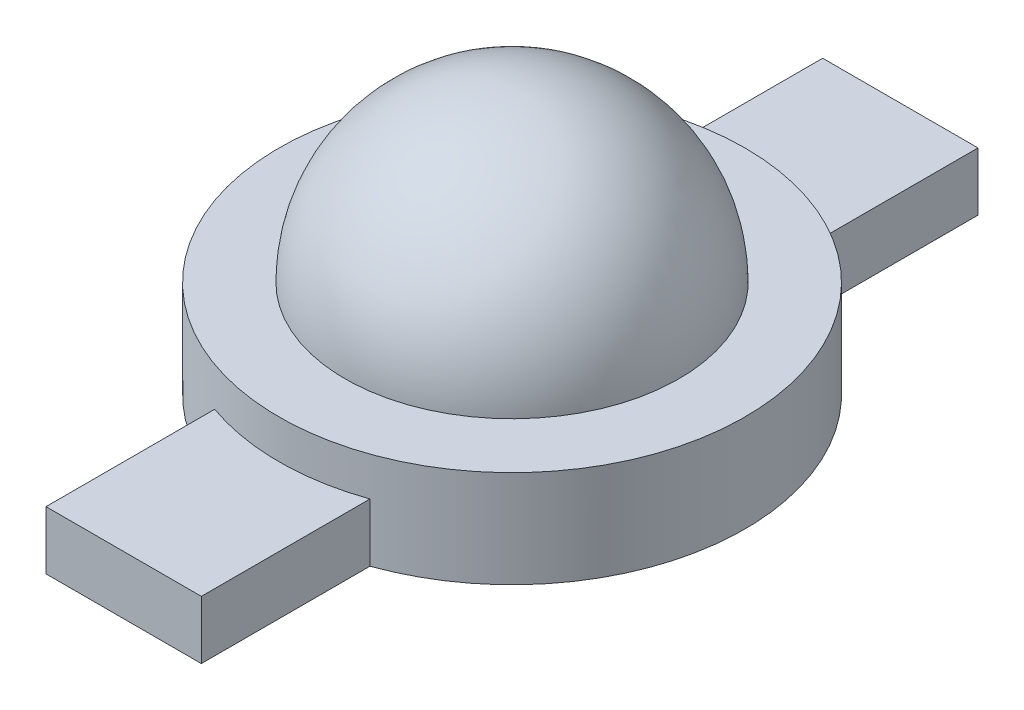
ISO-10303-21;
HEADER;
FILE_DESCRIPTION(('STEP AP214'),'2;1');
FILE_NAME('part.step','',(''),(''),'','','');
FILE_SCHEMA(('AUTOMOTIVE_DESIGN { 1 0 10303 214 1 1 1 1 }'));
ENDSEC;
DATA;
#1=APPLICATION_CONTEXT('core data for automotive mechanical design processes');
#2=APPLICATION_PROTOCOL_DEFINITION('international standard','automotive_design',2000,#1);
#3=PRODUCT_CONTEXT('',#1,'mechanical');
#4=PRODUCT('Part','Part','',(#3));
#5=PRODUCT_RELATED_PRODUCT_CATEGORY('part','',(#4));
#6=PRODUCT_DEFINITION_FORMATION('','',#4);
#7=PRODUCT_DEFINITION_CONTEXT('part definition',#1,'design');
#8=PRODUCT_DEFINITION('design','',#6,#7);
#9=PRODUCT_DEFINITION_SHAPE('','',#8);
#10=(LENGTH_UNIT() NAMED_UNIT(*) SI_UNIT(.MILLI.,.METRE.));
#11=(NAMED_UNIT(*) PLANE_ANGLE_UNIT() SI_UNIT($,.RADIAN.));
#12=(NAMED_UNIT(*) SI_UNIT($,.STERADIAN.) SOLID_ANGLE_UNIT());
#13=UNCERTAINTY_MEASURE_WITH_UNIT(LENGTH_MEASURE(1.E-05),#10,'distance_accuracy_value','');
#14=(GEOMETRIC_REPRESENTATION_CONTEXT(3) GLOBAL_UNCERTAINTY_ASSIGNED_CONTEXT((#13)) GLOBAL_UNIT_ASSIGNED_CONTEXT((#10,
#11,#12)) REPRESENTATION_CONTEXT('',''));
#15=CARTESIAN_POINT('',(0.,0.,0.));
#16=DIRECTION('',(0.,0.,1.));
#17=DIRECTION('',(1.,0.,0.));
#18=AXIS2_PLACEMENT_3D('',#15,#16,#17);
#19=CARTESIAN_POINT('',(0.,0.,0.));
#20=DIRECTION('',(0.,-1.,0.));
#21=DIRECTION('',(0.,0.,-1.));
#22=AXIS2_PLACEMENT_3D('',#19,#20,#21);
#23=SPHERICAL_SURFACE('',#22,4.3);
#24=CARTESIAN_POINT('',(0.,0.,0.));
#25=DIRECTION('',(0.,-1.,0.));
#26=DIRECTION('',(0.,0.,-1.));
#27=AXIS2_PLACEMENT_3D('',#24,#25,#26);
#28=CIRCLE('',#27,4.3);
#29=CARTESIAN_POINT('',(0.,0.,-4.3));
#30=VERTEX_POINT('',#29);
#31=EDGE_CURVE('E154',#30,#30,#28,.T.);
#32=ORIENTED_EDGE('',*,*,#31,.F.);
#33=EDGE_LOOP('',(#32));
#34=FACE_BOUND('',#33,.T.);
#35=ADVANCED_FACE('F32',(#34),#23,.T.);
#36=CARTESIAN_POINT('',(0.,-2.5,-6.));
#37=DIRECTION('',(0.,-1.,0.));
#38=DIRECTION('',(0.,0.,-1.));
#39=AXIS2_PLACEMENT_3D('',#36,#37,#38);
#40=PLANE('',#39);
#41=CARTESIAN_POINT('',(0.,-2.5,0.));
#42=DIRECTION('',(0.,-1.,0.));
#43=DIRECTION('',(0.,0.,-1.));
#44=AXIS2_PLACEMENT_3D('',#41,#42,#43);
#45=CIRCLE('',#44,6.);
#46=CARTESIAN_POINT('',(-2.,-2.5,5.65685424949239));
#47=VERTEX_POINT('',#46);
#48=CARTESIAN_POINT('',(-2.,-2.5,-5.65685424949238));
#49=VERTEX_POINT('',#48);
#50=EDGE_CURVE('E11',#47,#49,#45,.T.);
#51=ORIENTED_EDGE('',*,*,#50,.T.);
#52=DIRECTION('',(0.,0.,-1.));
#53=VECTOR('',#52,1.);
#54=CARTESIAN_POINT('',(-2.,-2.5,-10.));
#55=LINE('',#54,#53);
#56=CARTESIAN_POINT('',(-2.,-2.5,-10.));
#57=VERTEX_POINT('',#56);
#58=EDGE_CURVE('E120',#49,#57,#55,.T.);
#59=ORIENTED_EDGE('',*,*,#58,.T.);
#60=DIRECTION('',(1.,0.,0.));
#61=VECTOR('',#60,1.);
#62=CARTESIAN_POINT('',(0.,-2.5,-10.));
#63=LINE('',#62,#61);
#64=CARTESIAN_POINT('',(2.,-2.5,-10.));
#65=VERTEX_POINT('',#64);
#66=EDGE_CURVE('E118',#57,#65,#63,.T.);
#67=ORIENTED_EDGE('',*,*,#66,.T.);
#68=DIRECTION('',(0.,0.,1.));
#69=VECTOR('',#68,1.);
#70=CARTESIAN_POINT('',(2.,-2.5,-10.));
#71=LINE('',#70,#69);
#72=CARTESIAN_POINT('',(2.,-2.5,-5.65685424949238));
#73=VERTEX_POINT('',#72);
#74=EDGE_CURVE('E46',#65,#73,#71,.T.);
#75=ORIENTED_EDGE('',*,*,#74,.T.);
#76=CARTESIAN_POINT('',(2.,-2.5,5.65685424949238));
#77=VERTEX_POINT('',#76);
#78=EDGE_CURVE('E39',#73,#77,#45,.T.);
#79=ORIENTED_EDGE('',*,*,#78,.T.);
#80=DIRECTION('',(0.,0.,1.));
#81=VECTOR('',#80,1.);
#82=CARTESIAN_POINT('',(2.,-2.5,9.99999999999999));
#83=LINE('',#82,#81);
#84=CARTESIAN_POINT('',(2.,-2.5,9.99999999999999));
#85=VERTEX_POINT('',#84);
#86=EDGE_CURVE('E137',#77,#85,#83,.T.);
#87=ORIENTED_EDGE('',*,*,#86,.T.);
#88=DIRECTION('',(-1.,0.,0.));
#89=VECTOR('',#88,1.);
#90=CARTESIAN_POINT('',(0.,-2.5,9.99999999999999));
#91=LINE('',#90,#89);
#92=CARTESIAN_POINT('',(-2.,-2.5,9.99999999999999));
#93=VERTEX_POINT('',#92);
#94=EDGE_CURVE('E129',#85,#93,#91,.T.);
#95=ORIENTED_EDGE('',*,*,#94,.T.);
#96=DIRECTION('',(0.,0.,-1.));
#97=VECTOR('',#96,1.);
#98=CARTESIAN_POINT('',(-2.,-2.5,9.99999999999999));
#99=LINE('',#98,#97);
#100=EDGE_CURVE('E52',#93,#47,#99,.T.);
#101=ORIENTED_EDGE('',*,*,#100,.T.);
#102=EDGE_LOOP('',(#51,#59,#67,#75,#79,#87,#95,#101));
#103=FACE_BOUND('',#102,.T.);
#104=ADVANCED_FACE('F168',(#103),#40,.T.);
#105=CARTESIAN_POINT('',(0.,-2.5,0.));
#106=DIRECTION('',(0.,-1.,0.));
#107=DIRECTION('',(0.,0.,-1.));
#108=AXIS2_PLACEMENT_3D('',#105,#106,#107);
#109=CYLINDRICAL_SURFACE('',#108,6.);
#110=DIRECTION('',(0.,-1.,0.));
#111=VECTOR('',#110,1.);
#112=CARTESIAN_POINT('',(-2.,-1.,-5.65685424949238));
#113=LINE('',#112,#111);
#114=CARTESIAN_POINT('',(-2.,-1.,-5.65685424949238));
#115=VERTEX_POINT('',#114);
#116=EDGE_CURVE('E130',#115,#49,#113,.T.);
#117=ORIENTED_EDGE('',*,*,#116,.T.);
#118=ORIENTED_EDGE('',*,*,#50,.F.);
#119=DIRECTION('',(0.,-1.,0.));
#120=VECTOR('',#119,1.);
#121=CARTESIAN_POINT('',(-2.,-1.,5.65685424949239));
#122=LINE('',#121,#120);
#123=CARTESIAN_POINT('',(-2.,-1.,5.65685424949239));
#124=VERTEX_POINT('',#123);
#125=EDGE_CURVE('E158',#124,#47,#122,.T.);
#126=ORIENTED_EDGE('',*,*,#125,.F.);
#127=CARTESIAN_POINT('',(0.,-1.,0.));
#128=DIRECTION('',(0.,1.,0.));
#129=DIRECTION('',(0.,0.,1.));
#130=AXIS2_PLACEMENT_3D('',#127,#128,#129);
#131=CIRCLE('',#130,6.);
#132=CARTESIAN_POINT('',(2.,-1.,5.65685424949238));
#133=VERTEX_POINT('',#132);
#134=EDGE_CURVE('E140',#124,#133,#131,.T.);
#135=ORIENTED_EDGE('',*,*,#134,.T.);
#136=DIRECTION('',(0.,-1.,0.));
#137=VECTOR('',#136,1.);
#138=CARTESIAN_POINT('',(2.,-1.,5.65685424949238));
#139=LINE('',#138,#137);
#140=EDGE_CURVE('E155',#133,#77,#139,.T.);
#141=ORIENTED_EDGE('',*,*,#140,.T.);
#142=ORIENTED_EDGE('',*,*,#78,.F.);
#143=DIRECTION('',(0.,-1.,0.));
#144=VECTOR('',#143,1.);
#145=CARTESIAN_POINT('',(2.,-1.,-5.65685424949238));
#146=LINE('',#145,#144);
#147=CARTESIAN_POINT('',(2.,-1.,-5.65685424949238));
#148=VERTEX_POINT('',#147);
#149=EDGE_CURVE('E104',#148,#73,#146,.T.);
#150=ORIENTED_EDGE('',*,*,#149,.F.);
#151=CARTESIAN_POINT('',(0.,-1.,0.));
#152=DIRECTION('',(0.,1.,0.));
#153=DIRECTION('',(0.,0.,1.));
#154=AXIS2_PLACEMENT_3D('',#151,#152,#153);
#155=CIRCLE('',#154,6.);
#156=EDGE_CURVE('E113',#148,#115,#155,.T.);
#157=ORIENTED_EDGE('',*,*,#156,.T.);
#158=EDGE_LOOP('',(#117,#118,#126,#135,#141,#142,#150,#157));
#159=FACE_BOUND('',#158,.T.);
#160=CARTESIAN_POINT('',(0.,0.,0.));
#161=DIRECTION('',(0.,-1.,0.));
#162=DIRECTION('',(0.,0.,-1.));
#163=AXIS2_PLACEMENT_3D('',#160,#161,#162);
#164=CIRCLE('',#163,6.);
#165=CARTESIAN_POINT('',(0.,0.,-5.99999999999999));
#166=VERTEX_POINT('',#165);
#167=EDGE_CURVE('E162',#166,#166,#164,.T.);
#168=ORIENTED_EDGE('',*,*,#167,.T.);
#169=EDGE_LOOP('',(#168));
#170=FACE_BOUND('',#169,.T.);
#171=ADVANCED_FACE('F173',(#159,#170),#109,.T.);
#172=CARTESIAN_POINT('',(0.,0.,-4.3));
#173=DIRECTION('',(0.,1.,0.));
#174=DIRECTION('',(0.,0.,1.));
#175=AXIS2_PLACEMENT_3D('',#172,#173,#174);
#176=PLANE('',#175);
#177=ORIENTED_EDGE('',*,*,#31,.T.);
#178=EDGE_LOOP('',(#177));
#179=FACE_BOUND('',#178,.T.);
#180=ORIENTED_EDGE('',*,*,#167,.F.);
#181=EDGE_LOOP('',(#180));
#182=FACE_BOUND('',#181,.T.);
#183=ADVANCED_FACE('F201',(#179,#182),#176,.T.);
#184=CARTESIAN_POINT('',(2.,-1.,9.99999999999999));
#185=DIRECTION('',(1.,0.,0.));
#186=DIRECTION('',(0.,0.,-1.));
#187=AXIS2_PLACEMENT_3D('',#184,#185,#186);
#188=PLANE('',#187);
#189=ORIENTED_EDGE('',*,*,#86,.F.);
#190=ORIENTED_EDGE('',*,*,#140,.F.);
#191=DIRECTION('',(0.,0.,1.));
#192=VECTOR('',#191,1.);
#193=CARTESIAN_POINT('',(2.,-1.,9.99999999999999));
#194=LINE('',#193,#192);
#195=CARTESIAN_POINT('',(2.,-1.,9.99999999999999));
#196=VERTEX_POINT('',#195);
#197=EDGE_CURVE('E143',#133,#196,#194,.T.);
#198=ORIENTED_EDGE('',*,*,#197,.T.);
#199=DIRECTION('',(0.,-1.,0.));
#200=VECTOR('',#199,1.);
#201=CARTESIAN_POINT('',(2.,-1.,9.99999999999999));
#202=LINE('',#201,#200);
#203=EDGE_CURVE('E151',#196,#85,#202,.T.);
#204=ORIENTED_EDGE('',*,*,#203,.T.);
#205=EDGE_LOOP('',(#189,#190,#198,#204));
#206=FACE_BOUND('',#205,.T.);
#207=ADVANCED_FACE('F171',(#206),#188,.T.);
#208=CARTESIAN_POINT('',(-2.,-1.,9.99999999999999));
#209=DIRECTION('',(-1.,0.,0.));
#210=DIRECTION('',(0.,0.,1.));
#211=AXIS2_PLACEMENT_3D('',#208,#209,#210);
#212=PLANE('',#211);
#213=ORIENTED_EDGE('',*,*,#100,.F.);
#214=DIRECTION('',(0.,-1.,0.));
#215=VECTOR('',#214,1.);
#216=CARTESIAN_POINT('',(-2.,-1.,9.99999999999999));
#217=LINE('',#216,#215);
#218=CARTESIAN_POINT('',(-2.,-1.,9.99999999999999));
#219=VERTEX_POINT('',#218);
#220=EDGE_CURVE('E146',#219,#93,#217,.T.);
#221=ORIENTED_EDGE('',*,*,#220,.F.);
#222=DIRECTION('',(0.,0.,-1.));
#223=VECTOR('',#222,1.);
#224=CARTESIAN_POINT('',(-2.,-1.,9.99999999999999));
#225=LINE('',#224,#223);
#226=EDGE_CURVE('E136',#219,#124,#225,.T.);
#227=ORIENTED_EDGE('',*,*,#226,.T.);
#228=ORIENTED_EDGE('',*,*,#125,.T.);
#229=EDGE_LOOP('',(#213,#221,#227,#228));
#230=FACE_BOUND('',#229,.T.);
#231=ADVANCED_FACE('F182',(#230),#212,.T.);
#232=CARTESIAN_POINT('',(0.,-1.,9.99999999999999));
#233=DIRECTION('',(0.,0.,1.));
#234=DIRECTION('',(1.,0.,0.));
#235=AXIS2_PLACEMENT_3D('',#232,#233,#234);
#236=PLANE('',#235);
#237=ORIENTED_EDGE('',*,*,#94,.F.);
#238=ORIENTED_EDGE('',*,*,#203,.F.);
#239=DIRECTION('',(-1.,0.,0.));
#240=VECTOR('',#239,1.);
#241=CARTESIAN_POINT('',(0.,-1.,9.99999999999999));
#242=LINE('',#241,#240);
#243=EDGE_CURVE('E134',#196,#219,#242,.T.);
#244=ORIENTED_EDGE('',*,*,#243,.T.);
#245=ORIENTED_EDGE('',*,*,#220,.T.);
#246=EDGE_LOOP('',(#237,#238,#244,#245));
#247=FACE_BOUND('',#246,.T.);
#248=ADVANCED_FACE('F184',(#247),#236,.T.);
#249=CARTESIAN_POINT('',(0.,-1.,0.));
#250=DIRECTION('',(0.,1.,0.));
#251=DIRECTION('',(0.,0.,1.));
#252=AXIS2_PLACEMENT_3D('',#249,#250,#251);
#253=PLANE('',#252);
#254=ORIENTED_EDGE('',*,*,#243,.F.);
#255=ORIENTED_EDGE('',*,*,#197,.F.);
#256=ORIENTED_EDGE('',*,*,#134,.F.);
#257=ORIENTED_EDGE('',*,*,#226,.F.);
#258=EDGE_LOOP('',(#254,#255,#256,#257));
#259=FACE_BOUND('',#258,.T.);
#260=ADVANCED_FACE('F179',(#259),#253,.T.);
#261=CARTESIAN_POINT('',(0.,-1.,-10.));
#262=DIRECTION('',(0.,0.,-1.));
#263=DIRECTION('',(-1.,0.,0.));
#264=AXIS2_PLACEMENT_3D('',#261,#262,#263);
#265=PLANE('',#264);
#266=ORIENTED_EDGE('',*,*,#66,.F.);
#267=DIRECTION('',(0.,-1.,0.));
#268=VECTOR('',#267,1.);
#269=CARTESIAN_POINT('',(-2.,-1.,-10.));
#270=LINE('',#269,#268);
#271=CARTESIAN_POINT('',(-2.,-1.,-10.));
#272=VERTEX_POINT('',#271);
#273=EDGE_CURVE('E116',#272,#57,#270,.T.);
#274=ORIENTED_EDGE('',*,*,#273,.F.);
#275=DIRECTION('',(1.,0.,0.));
#276=VECTOR('',#275,1.);
#277=CARTESIAN_POINT('',(0.,-1.,-10.));
#278=LINE('',#277,#276);
#279=CARTESIAN_POINT('',(2.,-1.,-10.));
#280=VERTEX_POINT('',#279);
#281=EDGE_CURVE('E110',#272,#280,#278,.T.);
#282=ORIENTED_EDGE('',*,*,#281,.T.);
#283=DIRECTION('',(0.,-1.,0.));
#284=VECTOR('',#283,1.);
#285=CARTESIAN_POINT('',(2.,-1.,-10.));
#286=LINE('',#285,#284);
#287=EDGE_CURVE('E96',#280,#65,#286,.T.);
#288=ORIENTED_EDGE('',*,*,#287,.T.);
#289=EDGE_LOOP('',(#266,#274,#282,#288));
#290=FACE_BOUND('',#289,.T.);
#291=ADVANCED_FACE('F115',(#290),#265,.T.);
#292=CARTESIAN_POINT('',(-2.,-1.,-10.));
#293=DIRECTION('',(-1.,0.,0.));
#294=DIRECTION('',(0.,0.,1.));
#295=AXIS2_PLACEMENT_3D('',#292,#293,#294);
#296=PLANE('',#295);
#297=ORIENTED_EDGE('',*,*,#58,.F.);
#298=ORIENTED_EDGE('',*,*,#116,.F.);
#299=DIRECTION('',(0.,0.,-1.));
#300=VECTOR('',#299,1.);
#301=CARTESIAN_POINT('',(-2.,-1.,-10.));
#302=LINE('',#301,#300);
#303=EDGE_CURVE('E105',#115,#272,#302,.T.);
#304=ORIENTED_EDGE('',*,*,#303,.T.);
#305=ORIENTED_EDGE('',*,*,#273,.T.);
#306=EDGE_LOOP('',(#297,#298,#304,#305));
#307=FACE_BOUND('',#306,.T.);
#308=ADVANCED_FACE('F264',(#307),#296,.T.);
#309=CARTESIAN_POINT('',(2.,-1.,-10.));
#310=DIRECTION('',(1.,0.,0.));
#311=DIRECTION('',(0.,0.,-1.));
#312=AXIS2_PLACEMENT_3D('',#309,#310,#311);
#313=PLANE('',#312);
#314=ORIENTED_EDGE('',*,*,#74,.F.);
#315=ORIENTED_EDGE('',*,*,#287,.F.);
#316=DIRECTION('',(0.,0.,1.));
#317=VECTOR('',#316,1.);
#318=CARTESIAN_POINT('',(2.,-1.,-10.));
#319=LINE('',#318,#317);
#320=EDGE_CURVE('E99',#280,#148,#319,.T.);
#321=ORIENTED_EDGE('',*,*,#320,.T.);
#322=ORIENTED_EDGE('',*,*,#149,.T.);
#323=EDGE_LOOP('',(#314,#315,#321,#322));
#324=FACE_BOUND('',#323,.T.);
#325=ADVANCED_FACE('F98',(#324),#313,.T.);
#326=CARTESIAN_POINT('',(0.,-1.,0.));
#327=DIRECTION('',(0.,1.,0.));
#328=DIRECTION('',(0.,0.,1.));
#329=AXIS2_PLACEMENT_3D('',#326,#327,#328);
#330=PLANE('',#329);
#331=ORIENTED_EDGE('',*,*,#281,.F.);
#332=ORIENTED_EDGE('',*,*,#303,.F.);
#333=ORIENTED_EDGE('',*,*,#156,.F.);
#334=ORIENTED_EDGE('',*,*,#320,.F.);
#335=EDGE_LOOP('',(#331,#332,#333,#334));
#336=FACE_BOUND('',#335,.T.);
#337=ADVANCED_FACE('F108',(#336),#330,.T.);
#338=CLOSED_SHELL('',(#35,#104,#171,#183,#207,#231,#248,#260,#291,#308,#325,#337));
#339=MANIFOLD_SOLID_BREP('B2',#338);
#340=ADVANCED_BREP_SHAPE_REPRESENTATION('',(#18,#339),#14);
#341=SHAPE_DEFINITION_REPRESENTATION(#9,#340);
ENDSEC;
END-ISO-10303-21;
